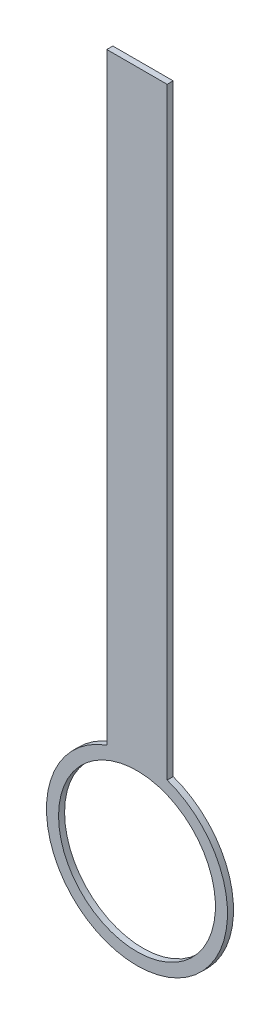
ISO-10303-21;
HEADER;
FILE_DESCRIPTION(('STEP AP214'),'2;1');
FILE_NAME('part.step','',(''),(''),'','','');
FILE_SCHEMA(('AUTOMOTIVE_DESIGN { 1 0 10303 214 1 1 1 1 }'));
ENDSEC;
DATA;
#1=APPLICATION_CONTEXT('core data for automotive mechanical design processes');
#2=APPLICATION_PROTOCOL_DEFINITION('international standard','automotive_design',2000,#1);
#3=PRODUCT_CONTEXT('',#1,'mechanical');
#4=PRODUCT('Part','Part','',(#3));
#5=PRODUCT_RELATED_PRODUCT_CATEGORY('part','',(#4));
#6=PRODUCT_DEFINITION_FORMATION('','',#4);
#7=PRODUCT_DEFINITION_CONTEXT('part definition',#1,'design');
#8=PRODUCT_DEFINITION('design','',#6,#7);
#9=PRODUCT_DEFINITION_SHAPE('','',#8);
#10=(LENGTH_UNIT() NAMED_UNIT(*) SI_UNIT(.MILLI.,.METRE.));
#11=(NAMED_UNIT(*) PLANE_ANGLE_UNIT() SI_UNIT($,.RADIAN.));
#12=(NAMED_UNIT(*) SI_UNIT($,.STERADIAN.) SOLID_ANGLE_UNIT());
#13=UNCERTAINTY_MEASURE_WITH_UNIT(LENGTH_MEASURE(1.E-05),#10,'distance_accuracy_value','');
#14=(GEOMETRIC_REPRESENTATION_CONTEXT(3) GLOBAL_UNCERTAINTY_ASSIGNED_CONTEXT((#13)) GLOBAL_UNIT_ASSIGNED_CONTEXT((#10,
#11,#12)) REPRESENTATION_CONTEXT('',''));
#15=CARTESIAN_POINT('',(0.,0.,0.));
#16=DIRECTION('',(0.,0.,1.));
#17=DIRECTION('',(1.,0.,0.));
#18=AXIS2_PLACEMENT_3D('',#15,#16,#17);
#19=CARTESIAN_POINT('',(0.,0.,2000.));
#20=DIRECTION('',(1.,0.,0.));
#21=DIRECTION('',(0.,0.,-1.));
#22=AXIS2_PLACEMENT_3D('',#19,#20,#21);
#23=PLANE('',#22);
#24=DIRECTION('',(0.,-1.,0.));
#25=VECTOR('',#24,1.);
#26=CARTESIAN_POINT('',(0.,0.,0.));
#27=LINE('',#26,#25);
#28=CARTESIAN_POINT('',(0.,200000.,0.));
#29=VERTEX_POINT('',#28);
#30=CARTESIAN_POINT('',(0.,284.271247461902,0.));
#31=VERTEX_POINT('',#30);
#32=EDGE_CURVE('E88',#29,#31,#27,.T.);
#33=ORIENTED_EDGE('',*,*,#32,.T.);
#34=DIRECTION('',(0.,0.,-1.));
#35=VECTOR('',#34,1.);
#36=CARTESIAN_POINT('',(0.,284.271247461902,2000.));
#37=LINE('',#36,#35);
#38=CARTESIAN_POINT('',(0.,284.271247461902,2000.));
#39=VERTEX_POINT('',#38);
#40=EDGE_CURVE('E61',#31,#39,#37,.F.);
#41=ORIENTED_EDGE('',*,*,#40,.T.);
#42=DIRECTION('',(0.,-1.,0.));
#43=VECTOR('',#42,1.);
#44=CARTESIAN_POINT('',(0.,0.,2000.));
#45=LINE('',#44,#43);
#46=CARTESIAN_POINT('',(0.,200000.,2000.));
#47=VERTEX_POINT('',#46);
#48=EDGE_CURVE('E107',#47,#39,#45,.T.);
#49=ORIENTED_EDGE('',*,*,#48,.F.);
#50=DIRECTION('',(0.,0.,-1.));
#51=VECTOR('',#50,1.);
#52=CARTESIAN_POINT('',(0.,200000.,2000.));
#53=LINE('',#52,#51);
#54=EDGE_CURVE('E46',#47,#29,#53,.T.);
#55=ORIENTED_EDGE('',*,*,#54,.T.);
#56=EDGE_LOOP('',(#33,#41,#49,#55));
#57=FACE_BOUND('',#56,.T.);
#58=ADVANCED_FACE('F39',(#57),#23,.F.);
#59=CARTESIAN_POINT('',(20000.,0.,2000.));
#60=DIRECTION('',(-1.,0.,0.));
#61=DIRECTION('',(0.,0.,1.));
#62=AXIS2_PLACEMENT_3D('',#59,#60,#61);
#63=PLANE('',#62);
#64=DIRECTION('',(0.,1.,0.));
#65=VECTOR('',#64,1.);
#66=CARTESIAN_POINT('',(20000.,0.,2000.));
#67=LINE('',#66,#65);
#68=CARTESIAN_POINT('',(20000.,284.271247461902,2000.));
#69=VERTEX_POINT('',#68);
#70=CARTESIAN_POINT('',(20000.,200000.,2000.));
#71=VERTEX_POINT('',#70);
#72=EDGE_CURVE('E53',#69,#71,#67,.T.);
#73=ORIENTED_EDGE('',*,*,#72,.F.);
#74=DIRECTION('',(0.,0.,-1.));
#75=VECTOR('',#74,1.);
#76=CARTESIAN_POINT('',(20000.,284.271247461902,2000.));
#77=LINE('',#76,#75);
#78=CARTESIAN_POINT('',(20000.,284.271247461906,0.));
#79=VERTEX_POINT('',#78);
#80=EDGE_CURVE('E90',#69,#79,#77,.T.);
#81=ORIENTED_EDGE('',*,*,#80,.T.);
#82=DIRECTION('',(0.,1.,0.));
#83=VECTOR('',#82,1.);
#84=CARTESIAN_POINT('',(20000.,0.,0.));
#85=LINE('',#84,#83);
#86=CARTESIAN_POINT('',(20000.,200000.,0.));
#87=VERTEX_POINT('',#86);
#88=EDGE_CURVE('E81',#79,#87,#85,.T.);
#89=ORIENTED_EDGE('',*,*,#88,.T.);
#90=DIRECTION('',(0.,0.,-1.));
#91=VECTOR('',#90,1.);
#92=CARTESIAN_POINT('',(20000.,200000.,2000.));
#93=LINE('',#92,#91);
#94=EDGE_CURVE('E12',#71,#87,#93,.T.);
#95=ORIENTED_EDGE('',*,*,#94,.F.);
#96=EDGE_LOOP('',(#73,#81,#89,#95));
#97=FACE_BOUND('',#96,.T.);
#98=ADVANCED_FACE('F91',(#97),#63,.F.);
#99=CARTESIAN_POINT('',(0.,200000.,2000.));
#100=DIRECTION('',(0.,-1.,0.));
#101=DIRECTION('',(0.,0.,-1.));
#102=AXIS2_PLACEMENT_3D('',#99,#100,#101);
#103=PLANE('',#102);
#104=DIRECTION('',(-1.,0.,0.));
#105=VECTOR('',#104,1.);
#106=CARTESIAN_POINT('',(0.,200000.,0.));
#107=LINE('',#106,#105);
#108=EDGE_CURVE('E87',#87,#29,#107,.T.);
#109=ORIENTED_EDGE('',*,*,#108,.T.);
#110=ORIENTED_EDGE('',*,*,#54,.F.);
#111=DIRECTION('',(-1.,0.,0.));
#112=VECTOR('',#111,1.);
#113=CARTESIAN_POINT('',(0.,200000.,2000.));
#114=LINE('',#113,#112);
#115=EDGE_CURVE('E110',#71,#47,#114,.T.);
#116=ORIENTED_EDGE('',*,*,#115,.F.);
#117=ORIENTED_EDGE('',*,*,#94,.T.);
#118=EDGE_LOOP('',(#109,#110,#116,#117));
#119=FACE_BOUND('',#118,.T.);
#120=ADVANCED_FACE('F117',(#119),#103,.F.);
#121=CARTESIAN_POINT('',(0.,0.,2000.));
#122=DIRECTION('',(0.,0.,-1.));
#123=DIRECTION('',(-1.,0.,0.));
#124=AXIS2_PLACEMENT_3D('',#121,#122,#123);
#125=PLANE('',#124);
#126=ORIENTED_EDGE('',*,*,#48,.T.);
#127=CARTESIAN_POINT('',(10000.,-28000.,2000.));
#128=DIRECTION('',(0.,0.,-1.));
#129=DIRECTION('',(-1.,0.,0.));
#130=AXIS2_PLACEMENT_3D('',#127,#128,#129);
#131=CIRCLE('',#130,30000.);
#132=EDGE_CURVE('E95',#69,#39,#131,.T.);
#133=ORIENTED_EDGE('',*,*,#132,.F.);
#134=ORIENTED_EDGE('',*,*,#72,.T.);
#135=ORIENTED_EDGE('',*,*,#115,.T.);
#136=EDGE_LOOP('',(#126,#133,#134,#135));
#137=FACE_BOUND('',#136,.T.);
#138=CARTESIAN_POINT('',(10000.,-28000.,2000.));
#139=DIRECTION('',(0.,0.,-1.));
#140=DIRECTION('',(-1.,0.,0.));
#141=AXIS2_PLACEMENT_3D('',#138,#139,#140);
#142=CIRCLE('',#141,26000.);
#143=CARTESIAN_POINT('',(-16000.,-28000.,2000.));
#144=VERTEX_POINT('',#143);
#145=EDGE_CURVE('E98',#144,#144,#142,.T.);
#146=ORIENTED_EDGE('',*,*,#145,.T.);
#147=EDGE_LOOP('',(#146));
#148=FACE_BOUND('',#147,.T.);
#149=ADVANCED_FACE('F119',(#137,#148),#125,.F.);
#150=CARTESIAN_POINT('',(0.,0.,0.));
#151=DIRECTION('',(0.,0.,-1.));
#152=DIRECTION('',(-1.,0.,0.));
#153=AXIS2_PLACEMENT_3D('',#150,#151,#152);
#154=PLANE('',#153);
#155=ORIENTED_EDGE('',*,*,#88,.F.);
#156=CARTESIAN_POINT('',(10000.,-28000.,0.));
#157=DIRECTION('',(0.,0.,-1.));
#158=DIRECTION('',(-1.,0.,0.));
#159=AXIS2_PLACEMENT_3D('',#156,#157,#158);
#160=CIRCLE('',#159,30000.);
#161=EDGE_CURVE('E86',#79,#31,#160,.T.);
#162=ORIENTED_EDGE('',*,*,#161,.T.);
#163=ORIENTED_EDGE('',*,*,#32,.F.);
#164=ORIENTED_EDGE('',*,*,#108,.F.);
#165=EDGE_LOOP('',(#155,#162,#163,#164));
#166=FACE_BOUND('',#165,.T.);
#167=CARTESIAN_POINT('',(10000.,-28000.,0.));
#168=DIRECTION('',(0.,0.,-1.));
#169=DIRECTION('',(-1.,0.,0.));
#170=AXIS2_PLACEMENT_3D('',#167,#168,#169);
#171=CIRCLE('',#170,26000.);
#172=CARTESIAN_POINT('',(-16000.,-28000.,0.));
#173=VERTEX_POINT('',#172);
#174=EDGE_CURVE('E102',#173,#173,#171,.T.);
#175=ORIENTED_EDGE('',*,*,#174,.F.);
#176=EDGE_LOOP('',(#175));
#177=FACE_BOUND('',#176,.T.);
#178=ADVANCED_FACE('F82',(#166,#177),#154,.T.);
#179=CARTESIAN_POINT('',(10000.,-28000.,2000.));
#180=DIRECTION('',(0.,0.,-1.));
#181=DIRECTION('',(-1.,0.,0.));
#182=AXIS2_PLACEMENT_3D('',#179,#180,#181);
#183=CYLINDRICAL_SURFACE('',#182,30000.);
#184=ORIENTED_EDGE('',*,*,#40,.F.);
#185=ORIENTED_EDGE('',*,*,#161,.F.);
#186=ORIENTED_EDGE('',*,*,#80,.F.);
#187=ORIENTED_EDGE('',*,*,#132,.T.);
#188=EDGE_LOOP('',(#184,#185,#186,#187));
#189=FACE_BOUND('',#188,.T.);
#190=ADVANCED_FACE('F97',(#189),#183,.T.);
#191=CARTESIAN_POINT('',(10000.,-28000.,2000.));
#192=DIRECTION('',(0.,0.,-1.));
#193=DIRECTION('',(-1.,0.,0.));
#194=AXIS2_PLACEMENT_3D('',#191,#192,#193);
#195=CYLINDRICAL_SURFACE('',#194,26000.);
#196=ORIENTED_EDGE('',*,*,#145,.F.);
#197=EDGE_LOOP('',(#196));
#198=FACE_BOUND('',#197,.T.);
#199=ORIENTED_EDGE('',*,*,#174,.T.);
#200=EDGE_LOOP('',(#199));
#201=FACE_BOUND('',#200,.T.);
#202=ADVANCED_FACE('F125',(#198,#201),#195,.F.);
#203=CLOSED_SHELL('',(#58,#98,#120,#149,#178,#190,#202));
#204=MANIFOLD_SOLID_BREP('B2',#203);
#205=ADVANCED_BREP_SHAPE_REPRESENTATION('',(#18,#204),#14);
#206=SHAPE_DEFINITION_REPRESENTATION(#9,#205);
ENDSEC;
END-ISO-10303-21;
